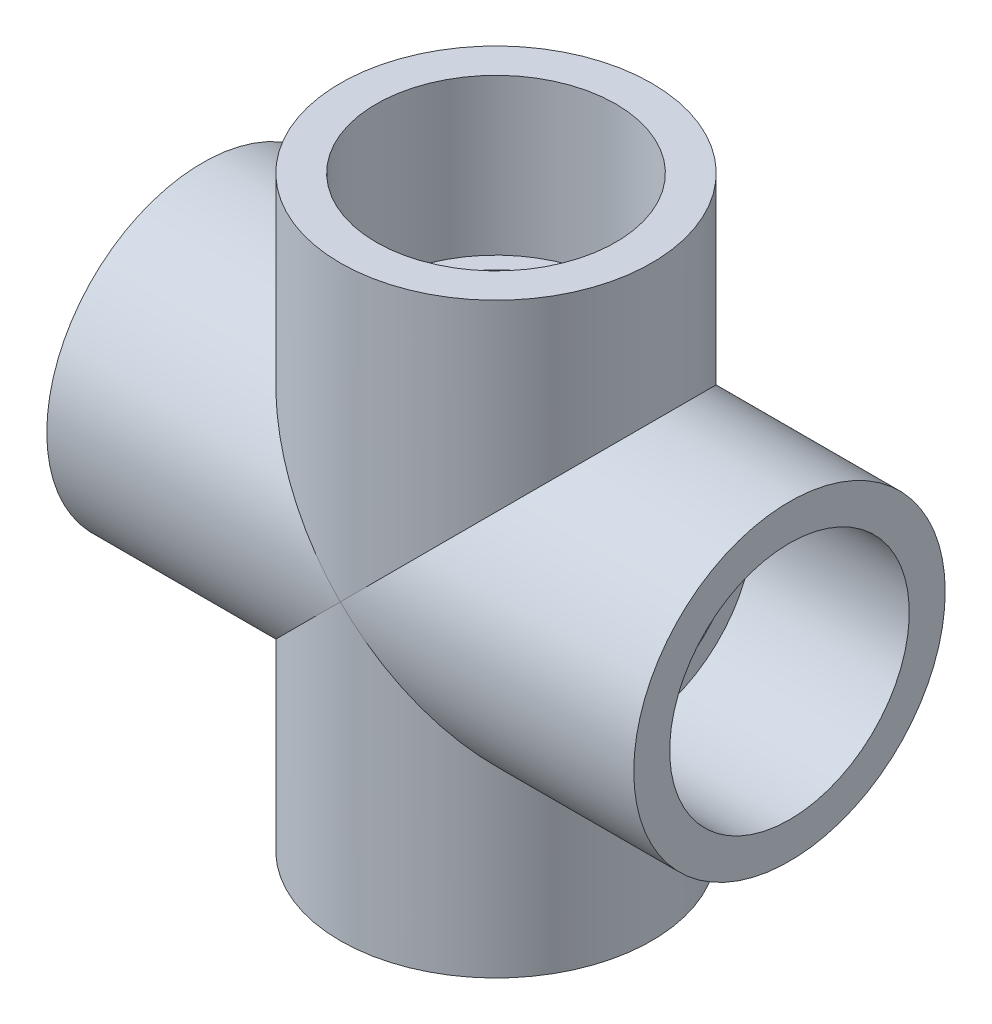
ISO-10303-21;
HEADER;
FILE_DESCRIPTION(('STEP AP214'),'2;1');
FILE_NAME('part.step','',(''),(''),'','','');
FILE_SCHEMA(('AUTOMOTIVE_DESIGN { 1 0 10303 214 1 1 1 1 }'));
ENDSEC;
DATA;
#1=APPLICATION_CONTEXT('core data for automotive mechanical design processes');
#2=APPLICATION_PROTOCOL_DEFINITION('international standard','automotive_design',2000,#1);
#3=PRODUCT_CONTEXT('',#1,'mechanical');
#4=PRODUCT('Part','Part','',(#3));
#5=PRODUCT_RELATED_PRODUCT_CATEGORY('part','',(#4));
#6=PRODUCT_DEFINITION_FORMATION('','',#4);
#7=PRODUCT_DEFINITION_CONTEXT('part definition',#1,'design');
#8=PRODUCT_DEFINITION('design','',#6,#7);
#9=PRODUCT_DEFINITION_SHAPE('','',#8);
#10=(LENGTH_UNIT() NAMED_UNIT(*) SI_UNIT(.MILLI.,.METRE.));
#11=(NAMED_UNIT(*) PLANE_ANGLE_UNIT() SI_UNIT($,.RADIAN.));
#12=(NAMED_UNIT(*) SI_UNIT($,.STERADIAN.) SOLID_ANGLE_UNIT());
#13=UNCERTAINTY_MEASURE_WITH_UNIT(LENGTH_MEASURE(1.E-05),#10,'distance_accuracy_value','');
#14=(GEOMETRIC_REPRESENTATION_CONTEXT(3) GLOBAL_UNCERTAINTY_ASSIGNED_CONTEXT((#13)) GLOBAL_UNIT_ASSIGNED_CONTEXT((#10,
#11,#12)) REPRESENTATION_CONTEXT('',''));
#15=CARTESIAN_POINT('',(0.,0.,0.));
#16=DIRECTION('',(0.,0.,1.));
#17=DIRECTION('',(1.,0.,0.));
#18=AXIS2_PLACEMENT_3D('',#15,#16,#17);
#19=CARTESIAN_POINT('',(0.000693674137099413,-2.44930632586297,0.));
#20=DIRECTION('',(0.,1.,0.));
#21=DIRECTION('',(0.,0.,1.));
#22=AXIS2_PLACEMENT_3D('',#19,#20,#21);
#23=CYLINDRICAL_SURFACE('',#22,0.85);
#24=CARTESIAN_POINT('',(0.000693674137099413,1.15069367413704,0.));
#25=DIRECTION('',(0.,1.,0.));
#26=DIRECTION('',(0.,0.,1.));
#27=AXIS2_PLACEMENT_3D('',#24,#25,#26);
#28=CIRCLE('',#27,0.85);
#29=CARTESIAN_POINT('',(0.000693674137099413,1.15069367413704,0.85));
#30=VERTEX_POINT('',#29);
#31=EDGE_CURVE('E89',#30,#30,#28,.T.);
#32=ORIENTED_EDGE('',*,*,#31,.T.);
#33=EDGE_LOOP('',(#32));
#34=FACE_BOUND('',#33,.T.);
#35=CARTESIAN_POINT('',(0.000693674137099413,0.000693674137035114,0.));
#36=DIRECTION('',(-0.707106781186546,0.707106781186549,0.));
#37=DIRECTION('',(0.707106781186549,0.707106781186546,0.));
#38=AXIS2_PLACEMENT_3D('',#35,#36,#37);
#39=ELLIPSE('',#38,1.20208152801713,0.85);
#40=CARTESIAN_POINT('',(0.000693674137099413,0.000693674137035114,-0.85));
#41=VERTEX_POINT('',#40);
#42=CARTESIAN_POINT('',(0.000693674137099413,0.000693674137035114,0.850000000000001));
#43=VERTEX_POINT('',#42);
#44=EDGE_CURVE('E52',#41,#43,#39,.F.);
#45=ORIENTED_EDGE('',*,*,#44,.T.);
#46=CARTESIAN_POINT('',(0.000693674137099413,0.000693674137035114,0.));
#47=DIRECTION('',(0.707106781186549,0.707106781186546,0.));
#48=DIRECTION('',(-0.707106781186546,0.707106781186549,0.));
#49=AXIS2_PLACEMENT_3D('',#46,#47,#48);
#50=ELLIPSE('',#49,1.20208152801713,0.85);
#51=EDGE_CURVE('E11',#43,#41,#50,.F.);
#52=ORIENTED_EDGE('',*,*,#51,.T.);
#53=EDGE_LOOP('',(#45,#52));
#54=FACE_BOUND('',#53,.T.);
#55=ADVANCED_FACE('F38',(#34,#54),#23,.F.);
#56=CARTESIAN_POINT('',(0.000693674137099413,2.45069367413704,0.));
#57=DIRECTION('',(0.,-1.,0.));
#58=DIRECTION('',(0.,0.,-1.));
#59=AXIS2_PLACEMENT_3D('',#56,#57,#58);
#60=CYLINDRICAL_SURFACE('',#59,1.3);
#61=CARTESIAN_POINT('',(0.000693674137099413,2.45069367413704,0.));
#62=DIRECTION('',(0.,1.,0.));
#63=DIRECTION('',(0.,0.,1.));
#64=AXIS2_PLACEMENT_3D('',#61,#62,#63);
#65=CIRCLE('',#64,1.3);
#66=CARTESIAN_POINT('',(0.000693674137099413,2.45069367413704,1.3));
#67=VERTEX_POINT('',#66);
#68=EDGE_CURVE('E102',#67,#67,#65,.T.);
#69=ORIENTED_EDGE('',*,*,#68,.F.);
#70=EDGE_LOOP('',(#69));
#71=FACE_BOUND('',#70,.T.);
#72=CARTESIAN_POINT('',(0.000693674137099413,0.000693674137035114,0.));
#73=DIRECTION('',(-0.707106781186549,-0.707106781186546,0.));
#74=DIRECTION('',(0.707106781186546,-0.707106781186549,0.));
#75=AXIS2_PLACEMENT_3D('',#72,#73,#74);
#76=ELLIPSE('',#75,1.83847763108503,1.3);
#77=CARTESIAN_POINT('',(0.000693674137099413,0.000693674137035114,1.3));
#78=VERTEX_POINT('',#77);
#79=CARTESIAN_POINT('',(0.000693674137099413,0.000693674137035114,-1.3));
#80=VERTEX_POINT('',#79);
#81=EDGE_CURVE('E93',#78,#80,#76,.T.);
#82=ORIENTED_EDGE('',*,*,#81,.F.);
#83=CARTESIAN_POINT('',(0.000693674137099413,0.000693674137035114,0.));
#84=DIRECTION('',(0.707106781186546,-0.707106781186549,0.));
#85=DIRECTION('',(-0.707106781186549,-0.707106781186546,0.));
#86=AXIS2_PLACEMENT_3D('',#83,#84,#85);
#87=ELLIPSE('',#86,1.83847763108502,1.3);
#88=EDGE_CURVE('E96',#80,#78,#87,.T.);
#89=ORIENTED_EDGE('',*,*,#88,.F.);
#90=EDGE_LOOP('',(#82,#89));
#91=FACE_BOUND('',#90,.T.);
#92=ADVANCED_FACE('F190',(#71,#91),#60,.T.);
#93=CARTESIAN_POINT('',(0.000693674137099413,2.45069367413704,0.));
#94=DIRECTION('',(0.,1.,0.));
#95=DIRECTION('',(0.,0.,1.));
#96=AXIS2_PLACEMENT_3D('',#93,#94,#95);
#97=PLANE('',#96);
#98=CARTESIAN_POINT('',(0.000693674137099413,2.45069367413704,0.));
#99=DIRECTION('',(0.,1.,0.));
#100=DIRECTION('',(0.,0.,1.));
#101=AXIS2_PLACEMENT_3D('',#98,#99,#100);
#102=CIRCLE('',#101,1.);
#103=CARTESIAN_POINT('',(0.000693674137099413,2.45069367413703,1.));
#104=VERTEX_POINT('',#103);
#105=EDGE_CURVE('E119',#104,#104,#102,.T.);
#106=ORIENTED_EDGE('',*,*,#105,.F.);
#107=EDGE_LOOP('',(#106));
#108=FACE_BOUND('',#107,.T.);
#109=ORIENTED_EDGE('',*,*,#68,.T.);
#110=EDGE_LOOP('',(#109));
#111=FACE_BOUND('',#110,.T.);
#112=ADVANCED_FACE('F201',(#108,#111),#97,.T.);
#113=CARTESIAN_POINT('',(-2.4493063258629,0.000693674137043668,0.));
#114=DIRECTION('',(1.,0.,0.));
#115=DIRECTION('',(0.,0.,1.));
#116=AXIS2_PLACEMENT_3D('',#113,#114,#115);
#117=PLANE('',#116);
#118=CARTESIAN_POINT('',(-2.4493063258629,0.000693674137060776,0.));
#119=DIRECTION('',(-1.,0.,0.));
#120=DIRECTION('',(0.,0.,1.));
#121=AXIS2_PLACEMENT_3D('',#118,#119,#120);
#122=CIRCLE('',#121,1.);
#123=CARTESIAN_POINT('',(-2.44930632586291,-0.999306325862939,0.));
#124=VERTEX_POINT('',#123);
#125=EDGE_CURVE('E88',#124,#124,#122,.T.);
#126=ORIENTED_EDGE('',*,*,#125,.F.);
#127=EDGE_LOOP('',(#126));
#128=FACE_BOUND('',#127,.T.);
#129=CARTESIAN_POINT('',(-2.4493063258629,0.000693674137043668,0.));
#130=DIRECTION('',(1.,0.,0.));
#131=DIRECTION('',(0.,0.,1.));
#132=AXIS2_PLACEMENT_3D('',#129,#130,#131);
#133=CIRCLE('',#132,1.3);
#134=CARTESIAN_POINT('',(-2.4493063258629,0.000693674137043668,1.3));
#135=VERTEX_POINT('',#134);
#136=EDGE_CURVE('E111',#135,#135,#133,.T.);
#137=ORIENTED_EDGE('',*,*,#136,.F.);
#138=EDGE_LOOP('',(#137));
#139=FACE_BOUND('',#138,.T.);
#140=ADVANCED_FACE('F194',(#128,#139),#117,.F.);
#141=CARTESIAN_POINT('',(2.4506936741371,0.00069367413702656,0.));
#142=DIRECTION('',(-1.,0.,0.));
#143=DIRECTION('',(0.,-1.,0.));
#144=AXIS2_PLACEMENT_3D('',#141,#142,#143);
#145=CYLINDRICAL_SURFACE('',#144,1.3);
#146=ORIENTED_EDGE('',*,*,#136,.T.);
#147=EDGE_LOOP('',(#146));
#148=FACE_BOUND('',#147,.T.);
#149=CARTESIAN_POINT('',(0.000693674137099413,0.000693674137035114,0.));
#150=DIRECTION('',(0.707106781186546,-0.707106781186549,0.));
#151=DIRECTION('',(-0.707106781186549,-0.707106781186546,0.));
#152=AXIS2_PLACEMENT_3D('',#149,#150,#151);
#153=ELLIPSE('',#152,1.83847763108502,1.3);
#154=EDGE_CURVE('E59',#80,#78,#153,.F.);
#155=ORIENTED_EDGE('',*,*,#154,.T.);
#156=ORIENTED_EDGE('',*,*,#81,.T.);
#157=EDGE_LOOP('',(#155,#156));
#158=FACE_BOUND('',#157,.T.);
#159=ADVANCED_FACE('F187',(#148,#158),#145,.T.);
#160=CARTESIAN_POINT('',(0.000693674137099413,-2.44930632586297,0.));
#161=DIRECTION('',(0.,1.,0.));
#162=DIRECTION('',(0.,0.,1.));
#163=AXIS2_PLACEMENT_3D('',#160,#161,#162);
#164=PLANE('',#163);
#165=CARTESIAN_POINT('',(0.000693674137099413,-2.44930632586297,0.));
#166=DIRECTION('',(0.,-1.,0.));
#167=DIRECTION('',(0.,0.,1.));
#168=AXIS2_PLACEMENT_3D('',#165,#166,#167);
#169=CIRCLE('',#168,1.);
#170=CARTESIAN_POINT('',(0.000693674137099413,-2.44930632586297,-1.));
#171=VERTEX_POINT('',#170);
#172=EDGE_CURVE('E135',#171,#171,#169,.T.);
#173=ORIENTED_EDGE('',*,*,#172,.F.);
#174=EDGE_LOOP('',(#173));
#175=FACE_BOUND('',#174,.T.);
#176=CARTESIAN_POINT('',(0.000693674137099413,-2.44930632586297,0.));
#177=DIRECTION('',(0.,1.,0.));
#178=DIRECTION('',(0.,0.,1.));
#179=AXIS2_PLACEMENT_3D('',#176,#177,#178);
#180=CIRCLE('',#179,1.3);
#181=CARTESIAN_POINT('',(0.000693674137099413,-2.44930632586297,1.3));
#182=VERTEX_POINT('',#181);
#183=EDGE_CURVE('E103',#182,#182,#180,.T.);
#184=ORIENTED_EDGE('',*,*,#183,.F.);
#185=EDGE_LOOP('',(#184));
#186=FACE_BOUND('',#185,.T.);
#187=ADVANCED_FACE('F193',(#175,#186),#164,.F.);
#188=ORIENTED_EDGE('',*,*,#183,.T.);
#189=EDGE_LOOP('',(#188));
#190=FACE_BOUND('',#189,.T.);
#191=CARTESIAN_POINT('',(0.000693674137099413,0.000693674137035114,0.));
#192=DIRECTION('',(-0.707106781186549,-0.707106781186546,0.));
#193=DIRECTION('',(0.707106781186546,-0.707106781186549,0.));
#194=AXIS2_PLACEMENT_3D('',#191,#192,#193);
#195=ELLIPSE('',#194,1.83847763108503,1.3);
#196=EDGE_CURVE('E78',#78,#80,#195,.F.);
#197=ORIENTED_EDGE('',*,*,#196,.F.);
#198=ORIENTED_EDGE('',*,*,#154,.F.);
#199=EDGE_LOOP('',(#197,#198));
#200=FACE_BOUND('',#199,.T.);
#201=ADVANCED_FACE('F40',(#190,#200),#60,.T.);
#202=CARTESIAN_POINT('',(2.4506936741371,0.00069367413702656,0.));
#203=DIRECTION('',(1.,0.,0.));
#204=DIRECTION('',(0.,0.,1.));
#205=AXIS2_PLACEMENT_3D('',#202,#203,#204);
#206=CIRCLE('',#205,1.3);
#207=CARTESIAN_POINT('',(2.4506936741371,0.00069367413702656,1.3));
#208=VERTEX_POINT('',#207);
#209=EDGE_CURVE('E107',#208,#208,#206,.T.);
#210=ORIENTED_EDGE('',*,*,#209,.F.);
#211=EDGE_LOOP('',(#210));
#212=FACE_BOUND('',#211,.T.);
#213=ORIENTED_EDGE('',*,*,#88,.T.);
#214=ORIENTED_EDGE('',*,*,#196,.T.);
#215=EDGE_LOOP('',(#213,#214));
#216=FACE_BOUND('',#215,.T.);
#217=ADVANCED_FACE('F180',(#212,#216),#145,.T.);
#218=CARTESIAN_POINT('',(2.4506936741371,0.00069367413702656,0.));
#219=DIRECTION('',(1.,0.,0.));
#220=DIRECTION('',(0.,0.,1.));
#221=AXIS2_PLACEMENT_3D('',#218,#219,#220);
#222=PLANE('',#221);
#223=CARTESIAN_POINT('',(2.4506936741371,0.00069367413702656,0.));
#224=DIRECTION('',(1.,0.,0.));
#225=DIRECTION('',(0.,0.,1.));
#226=AXIS2_PLACEMENT_3D('',#223,#224,#225);
#227=CIRCLE('',#226,1.);
#228=CARTESIAN_POINT('',(2.4506936741371,1.00069367413703,0.));
#229=VERTEX_POINT('',#228);
#230=EDGE_CURVE('E127',#229,#229,#227,.T.);
#231=ORIENTED_EDGE('',*,*,#230,.F.);
#232=EDGE_LOOP('',(#231));
#233=FACE_BOUND('',#232,.T.);
#234=ORIENTED_EDGE('',*,*,#209,.T.);
#235=EDGE_LOOP('',(#234));
#236=FACE_BOUND('',#235,.T.);
#237=ADVANCED_FACE('F176',(#233,#236),#222,.T.);
#238=CARTESIAN_POINT('',(0.000693674137099413,1.15069367413704,0.));
#239=DIRECTION('',(0.,1.,0.));
#240=DIRECTION('',(0.,0.,1.));
#241=AXIS2_PLACEMENT_3D('',#238,#239,#240);
#242=CYLINDRICAL_SURFACE('',#241,1.);
#243=CARTESIAN_POINT('',(0.000693674137099413,1.15069367413704,0.));
#244=DIRECTION('',(0.,1.,0.));
#245=DIRECTION('',(0.,0.,1.));
#246=AXIS2_PLACEMENT_3D('',#243,#244,#245);
#247=CIRCLE('',#246,1.);
#248=CARTESIAN_POINT('',(0.000693674137099413,1.15069367413704,1.));
#249=VERTEX_POINT('',#248);
#250=EDGE_CURVE('E115',#249,#249,#247,.T.);
#251=CARTESIAN_POINT('',(0.000693674137099413,1.15069367413704,1.));
#252=CARTESIAN_POINT('',(0.000693674137099413,1.1642353408037,1.));
#253=CARTESIAN_POINT('',(0.000693674137099413,1.17777700747037,1.));
#254=CARTESIAN_POINT('',(0.000693674137099413,1.2048603408037,1.));
#255=CARTESIAN_POINT('',(0.000693674137099413,1.21840200747037,1.));
#256=CARTESIAN_POINT('',(0.000693674137099413,1.2454853408037,1.));
#257=CARTESIAN_POINT('',(0.000693674137099413,1.25902700747037,1.));
#258=CARTESIAN_POINT('',(0.000693674137099413,1.2861103408037,1.));
#259=CARTESIAN_POINT('',(0.000693674137099413,1.29965200747037,1.));
#260=CARTESIAN_POINT('',(0.000693674137099413,1.3267353408037,1.));
#261=CARTESIAN_POINT('',(0.000693674137099413,1.34027700747037,1.));
#262=CARTESIAN_POINT('',(0.000693674137099413,1.3673603408037,1.));
#263=CARTESIAN_POINT('',(0.000693674137099413,1.38090200747037,1.));
#264=CARTESIAN_POINT('',(0.000693674137099413,1.4079853408037,1.));
#265=CARTESIAN_POINT('',(0.000693674137099413,1.42152700747037,1.));
#266=CARTESIAN_POINT('',(0.000693674137099413,1.4486103408037,1.));
#267=CARTESIAN_POINT('',(0.000693674137099413,1.46215200747037,1.));
#268=CARTESIAN_POINT('',(0.000693674137099413,1.4892353408037,1.));
#269=CARTESIAN_POINT('',(0.000693674137099413,1.50277700747037,1.));
#270=CARTESIAN_POINT('',(0.000693674137099413,1.5298603408037,1.));
#271=CARTESIAN_POINT('',(0.000693674137099413,1.54340200747037,1.));
#272=CARTESIAN_POINT('',(0.000693674137099413,1.5704853408037,1.));
#273=CARTESIAN_POINT('',(0.000693674137099413,1.58402700747037,1.));
#274=CARTESIAN_POINT('',(0.000693674137099413,1.6111103408037,1.));
#275=CARTESIAN_POINT('',(0.000693674137099413,1.62465200747037,1.));
#276=CARTESIAN_POINT('',(0.000693674137099413,1.6517353408037,1.));
#277=CARTESIAN_POINT('',(0.000693674137099413,1.66527700747037,1.));
#278=CARTESIAN_POINT('',(0.000693674137099413,1.6923603408037,1.));
#279=CARTESIAN_POINT('',(0.000693674137099413,1.70590200747037,1.));
#280=CARTESIAN_POINT('',(0.000693674137099413,1.7329853408037,1.));
#281=CARTESIAN_POINT('',(0.000693674137099413,1.74652700747037,1.));
#282=CARTESIAN_POINT('',(0.000693674137099413,1.7736103408037,1.));
#283=CARTESIAN_POINT('',(0.000693674137099413,1.78715200747037,1.));
#284=CARTESIAN_POINT('',(0.000693674137099413,1.8142353408037,1.));
#285=CARTESIAN_POINT('',(0.000693674137099413,1.82777700747037,1.));
#286=CARTESIAN_POINT('',(0.000693674137099413,1.8548603408037,1.));
#287=CARTESIAN_POINT('',(0.000693674137099413,1.86840200747037,1.));
#288=CARTESIAN_POINT('',(0.000693674137099413,1.8954853408037,1.));
#289=CARTESIAN_POINT('',(0.000693674137099413,1.90902700747037,1.));
#290=CARTESIAN_POINT('',(0.000693674137099413,1.9361103408037,1.));
#291=CARTESIAN_POINT('',(0.000693674137099413,1.94965200747037,1.));
#292=CARTESIAN_POINT('',(0.000693674137099413,1.9767353408037,1.));
#293=CARTESIAN_POINT('',(0.000693674137099413,1.99027700747037,1.));
#294=CARTESIAN_POINT('',(0.000693674137099413,2.0173603408037,1.));
#295=CARTESIAN_POINT('',(0.000693674137099413,2.03090200747037,1.));
#296=CARTESIAN_POINT('',(0.000693674137099413,2.0579853408037,1.));
#297=CARTESIAN_POINT('',(0.000693674137099413,2.07152700747037,1.));
#298=CARTESIAN_POINT('',(0.000693674137099413,2.0986103408037,1.));
#299=CARTESIAN_POINT('',(0.000693674137099413,2.11215200747037,1.));
#300=CARTESIAN_POINT('',(0.000693674137099413,2.1392353408037,1.));
#301=CARTESIAN_POINT('',(0.000693674137099413,2.15277700747037,1.));
#302=CARTESIAN_POINT('',(0.000693674137099413,2.1798603408037,1.));
#303=CARTESIAN_POINT('',(0.000693674137099413,2.19340200747037,1.));
#304=CARTESIAN_POINT('',(0.000693674137099413,2.2204853408037,1.));
#305=CARTESIAN_POINT('',(0.000693674137099413,2.23402700747037,1.));
#306=CARTESIAN_POINT('',(0.000693674137099413,2.2611103408037,1.));
#307=CARTESIAN_POINT('',(0.000693674137099413,2.27465200747037,1.));
#308=CARTESIAN_POINT('',(0.000693674137099413,2.3017353408037,1.));
#309=CARTESIAN_POINT('',(0.000693674137099413,2.31527700747037,1.));
#310=CARTESIAN_POINT('',(0.000693674137099413,2.3423603408037,1.));
#311=CARTESIAN_POINT('',(0.000693674137099413,2.35590200747037,1.));
#312=CARTESIAN_POINT('',(0.000693674137099413,2.3829853408037,1.));
#313=CARTESIAN_POINT('',(0.000693674137099413,2.39652700747037,1.));
#314=CARTESIAN_POINT('',(0.000693674137099413,2.4236103408037,1.));
#315=CARTESIAN_POINT('',(0.000693674137099413,2.43715200747037,1.));
#316=CARTESIAN_POINT('',(0.000693674137099413,2.45069367413703,1.));
#317=B_SPLINE_CURVE_WITH_KNOTS('',3,(#251,#252,#253,#254,#255,#256,#257,#258,#259,#260,#261,
#262,#263,#264,#265,#266,#267,#268,#269,#270,#271,#272,#273,#274,#275,#276,#277,#278,#279,#280,
#281,#282,#283,#284,#285,#286,#287,#288,#289,#290,#291,#292,#293,#294,#295,#296,#297,#298,#299,
#300,#301,#302,#303,#304,#305,#306,#307,#308,#309,#310,#311,#312,#313,#314,#315,#316),
.UNSPECIFIED.,.F.,.F.,(4,2,2,2,2,2,2,2,2,2,2,2,2,2,2,2,2,2,2,2,2,2,2,2,2,2,2,2,2,2,2,2,4),(0.,
0.0406249999999999,0.0812499999999999,0.121875,0.1625,0.203125,0.24375,0.284375,0.325,0.365625,
0.40625,0.446875,0.4875,0.528125,0.56875,0.609375,0.65,0.690625,0.73125,0.771875,0.8125,
0.853125,0.89375,0.934375,0.975,1.015625,1.05625,1.096875,1.1375,1.178125,1.21875,1.259375,1.3),.UNSPECIFIED.);
#318=EDGE_CURVE('BSEAM179',#249,#104,#317,.T.);
#319=ORIENTED_EDGE('',*,*,#250,.F.);
#320=ORIENTED_EDGE('',*,*,#105,.T.);
#321=ORIENTED_EDGE('',*,*,#318,.T.);
#322=ORIENTED_EDGE('',*,*,#318,.F.);
#323=EDGE_LOOP('',(#319,#321,#320,#322));
#324=FACE_BOUND('',#323,.T.);
#325=ADVANCED_FACE('F179',(#324),#242,.F.);
#326=CARTESIAN_POINT('',(0.000693674137099413,1.15069367413704,0.));
#327=DIRECTION('',(0.,1.,0.));
#328=DIRECTION('',(0.,0.,1.));
#329=AXIS2_PLACEMENT_3D('',#326,#327,#328);
#330=PLANE('',#329);
#331=ORIENTED_EDGE('',*,*,#31,.F.);
#332=EDGE_LOOP('',(#331));
#333=FACE_BOUND('',#332,.T.);
#334=ORIENTED_EDGE('',*,*,#250,.T.);
#335=EDGE_LOOP('',(#334));
#336=FACE_BOUND('',#335,.T.);
#337=ADVANCED_FACE('F172',(#333,#336),#330,.T.);
#338=CARTESIAN_POINT('',(1.1506936741371,0.000693674137031098,0.));
#339=DIRECTION('',(1.,0.,0.));
#340=DIRECTION('',(0.,1.,0.));
#341=AXIS2_PLACEMENT_3D('',#338,#339,#340);
#342=CYLINDRICAL_SURFACE('',#341,1.);
#343=CARTESIAN_POINT('',(1.1506936741371,0.000693674137031098,0.));
#344=DIRECTION('',(1.,0.,0.));
#345=DIRECTION('',(0.,0.,1.));
#346=AXIS2_PLACEMENT_3D('',#343,#344,#345);
#347=CIRCLE('',#346,1.);
#348=CARTESIAN_POINT('',(1.1506936741371,1.00069367413703,0.));
#349=VERTEX_POINT('',#348);
#350=EDGE_CURVE('E123',#349,#349,#347,.T.);
#351=CARTESIAN_POINT('',(1.1506936741371,1.00069367413703,0.));
#352=CARTESIAN_POINT('',(1.16423534080377,1.00069367413703,0.));
#353=CARTESIAN_POINT('',(1.17777700747044,1.00069367413703,0.));
#354=CARTESIAN_POINT('',(1.20486034080377,1.00069367413703,0.));
#355=CARTESIAN_POINT('',(1.21840200747044,1.00069367413703,0.));
#356=CARTESIAN_POINT('',(1.24548534080377,1.00069367413703,0.));
#357=CARTESIAN_POINT('',(1.25902700747044,1.00069367413703,0.));
#358=CARTESIAN_POINT('',(1.28611034080377,1.00069367413703,0.));
#359=CARTESIAN_POINT('',(1.29965200747044,1.00069367413703,0.));
#360=CARTESIAN_POINT('',(1.32673534080377,1.00069367413703,0.));
#361=CARTESIAN_POINT('',(1.34027700747044,1.00069367413703,0.));
#362=CARTESIAN_POINT('',(1.36736034080377,1.00069367413703,0.));
#363=CARTESIAN_POINT('',(1.38090200747044,1.00069367413703,0.));
#364=CARTESIAN_POINT('',(1.40798534080377,1.00069367413703,0.));
#365=CARTESIAN_POINT('',(1.42152700747044,1.00069367413703,0.));
#366=CARTESIAN_POINT('',(1.44861034080377,1.00069367413703,0.));
#367=CARTESIAN_POINT('',(1.46215200747044,1.00069367413703,0.));
#368=CARTESIAN_POINT('',(1.48923534080377,1.00069367413703,0.));
#369=CARTESIAN_POINT('',(1.50277700747044,1.00069367413703,0.));
#370=CARTESIAN_POINT('',(1.52986034080377,1.00069367413703,0.));
#371=CARTESIAN_POINT('',(1.54340200747044,1.00069367413703,0.));
#372=CARTESIAN_POINT('',(1.57048534080377,1.00069367413703,0.));
#373=CARTESIAN_POINT('',(1.58402700747044,1.00069367413703,0.));
#374=CARTESIAN_POINT('',(1.61111034080377,1.00069367413703,0.));
#375=CARTESIAN_POINT('',(1.62465200747044,1.00069367413703,0.));
#376=CARTESIAN_POINT('',(1.65173534080377,1.00069367413703,0.));
#377=CARTESIAN_POINT('',(1.66527700747044,1.00069367413703,0.));
#378=CARTESIAN_POINT('',(1.69236034080377,1.00069367413703,0.));
#379=CARTESIAN_POINT('',(1.70590200747044,1.00069367413703,0.));
#380=CARTESIAN_POINT('',(1.73298534080377,1.00069367413703,0.));
#381=CARTESIAN_POINT('',(1.74652700747044,1.00069367413703,0.));
#382=CARTESIAN_POINT('',(1.77361034080377,1.00069367413703,0.));
#383=CARTESIAN_POINT('',(1.78715200747044,1.00069367413703,0.));
#384=CARTESIAN_POINT('',(1.81423534080377,1.00069367413703,0.));
#385=CARTESIAN_POINT('',(1.82777700747044,1.00069367413703,0.));
#386=CARTESIAN_POINT('',(1.85486034080377,1.00069367413703,0.));
#387=CARTESIAN_POINT('',(1.86840200747044,1.00069367413703,0.));
#388=CARTESIAN_POINT('',(1.89548534080377,1.00069367413703,0.));
#389=CARTESIAN_POINT('',(1.90902700747044,1.00069367413703,0.));
#390=CARTESIAN_POINT('',(1.93611034080377,1.00069367413703,0.));
#391=CARTESIAN_POINT('',(1.94965200747044,1.00069367413703,0.));
#392=CARTESIAN_POINT('',(1.97673534080377,1.00069367413703,0.));
#393=CARTESIAN_POINT('',(1.99027700747044,1.00069367413703,0.));
#394=CARTESIAN_POINT('',(2.01736034080377,1.00069367413703,0.));
#395=CARTESIAN_POINT('',(2.03090200747044,1.00069367413703,0.));
#396=CARTESIAN_POINT('',(2.05798534080377,1.00069367413703,0.));
#397=CARTESIAN_POINT('',(2.07152700747044,1.00069367413703,0.));
#398=CARTESIAN_POINT('',(2.09861034080377,1.00069367413703,0.));
#399=CARTESIAN_POINT('',(2.11215200747044,1.00069367413703,0.));
#400=CARTESIAN_POINT('',(2.13923534080377,1.00069367413703,0.));
#401=CARTESIAN_POINT('',(2.15277700747044,1.00069367413703,0.));
#402=CARTESIAN_POINT('',(2.17986034080377,1.00069367413703,0.));
#403=CARTESIAN_POINT('',(2.19340200747044,1.00069367413703,0.));
#404=CARTESIAN_POINT('',(2.22048534080377,1.00069367413703,0.));
#405=CARTESIAN_POINT('',(2.23402700747044,1.00069367413703,0.));
#406=CARTESIAN_POINT('',(2.26111034080377,1.00069367413703,0.));
#407=CARTESIAN_POINT('',(2.27465200747044,1.00069367413703,0.));
#408=CARTESIAN_POINT('',(2.30173534080377,1.00069367413703,0.));
#409=CARTESIAN_POINT('',(2.31527700747044,1.00069367413703,0.));
#410=CARTESIAN_POINT('',(2.34236034080377,1.00069367413703,0.));
#411=CARTESIAN_POINT('',(2.35590200747044,1.00069367413703,0.));
#412=CARTESIAN_POINT('',(2.38298534080377,1.00069367413703,0.));
#413=CARTESIAN_POINT('',(2.39652700747044,1.00069367413703,0.));
#414=CARTESIAN_POINT('',(2.42361034080377,1.00069367413703,0.));
#415=CARTESIAN_POINT('',(2.43715200747044,1.00069367413703,0.));
#416=CARTESIAN_POINT('',(2.4506936741371,1.00069367413703,0.));
#417=B_SPLINE_CURVE_WITH_KNOTS('',3,(#351,#352,#353,#354,#355,#356,#357,#358,#359,#360,#361,
#362,#363,#364,#365,#366,#367,#368,#369,#370,#371,#372,#373,#374,#375,#376,#377,#378,#379,#380,
#381,#382,#383,#384,#385,#386,#387,#388,#389,#390,#391,#392,#393,#394,#395,#396,#397,#398,#399,
#400,#401,#402,#403,#404,#405,#406,#407,#408,#409,#410,#411,#412,#413,#414,#415,#416),
.UNSPECIFIED.,.F.,.F.,(4,2,2,2,2,2,2,2,2,2,2,2,2,2,2,2,2,2,2,2,2,2,2,2,2,2,2,2,2,2,2,2,4),(0.,
0.0406250000000001,0.0812500000000002,0.121875,0.1625,0.203125,0.24375,0.284375,0.325,0.365625,
0.40625,0.446875,0.4875,0.528125,0.56875,0.609375,0.65,0.690625,0.73125,0.771875,
0.812500000000001,0.853125000000001,0.893750000000001,0.934375000000001,0.975,1.015625,1.05625,
1.096875,1.1375,1.178125,1.21875,1.259375,1.3),.UNSPECIFIED.);
#418=EDGE_CURVE('BSEAM166',#349,#229,#417,.T.);
#419=ORIENTED_EDGE('',*,*,#350,.F.);
#420=ORIENTED_EDGE('',*,*,#230,.T.);
#421=ORIENTED_EDGE('',*,*,#418,.T.);
#422=ORIENTED_EDGE('',*,*,#418,.F.);
#423=EDGE_LOOP('',(#419,#421,#420,#422));
#424=FACE_BOUND('',#423,.T.);
#425=ADVANCED_FACE('F166',(#424),#342,.F.);
#426=CARTESIAN_POINT('',(1.1506936741371,0.000693674137031098,0.));
#427=DIRECTION('',(1.,0.,0.));
#428=DIRECTION('',(0.,0.,1.));
#429=AXIS2_PLACEMENT_3D('',#426,#427,#428);
#430=PLANE('',#429);
#431=CARTESIAN_POINT('',(1.1506936741371,0.000693674137031098,0.));
#432=DIRECTION('',(1.,0.,0.));
#433=DIRECTION('',(0.,0.,1.));
#434=AXIS2_PLACEMENT_3D('',#431,#432,#433);
#435=CIRCLE('',#434,0.85);
#436=CARTESIAN_POINT('',(1.1506936741371,0.000693674137031098,0.85));
#437=VERTEX_POINT('',#436);
#438=EDGE_CURVE('E156',#437,#437,#435,.T.);
#439=ORIENTED_EDGE('',*,*,#438,.F.);
#440=EDGE_LOOP('',(#439));
#441=FACE_BOUND('',#440,.T.);
#442=ORIENTED_EDGE('',*,*,#350,.T.);
#443=EDGE_LOOP('',(#442));
#444=FACE_BOUND('',#443,.T.);
#445=ADVANCED_FACE('F162',(#441,#444),#430,.T.);
#446=CARTESIAN_POINT('',(0.000693674137099413,-1.14930632586297,0.));
#447=DIRECTION('',(0.,-1.,0.));
#448=DIRECTION('',(0.,0.,-1.));
#449=AXIS2_PLACEMENT_3D('',#446,#447,#448);
#450=CYLINDRICAL_SURFACE('',#449,1.);
#451=CARTESIAN_POINT('',(0.000693674137099413,-1.14930632586297,0.));
#452=DIRECTION('',(0.,-1.,0.));
#453=DIRECTION('',(0.,0.,1.));
#454=AXIS2_PLACEMENT_3D('',#451,#452,#453);
#455=CIRCLE('',#454,1.);
#456=CARTESIAN_POINT('',(0.000693674137099413,-1.14930632586297,-1.));
#457=VERTEX_POINT('',#456);
#458=EDGE_CURVE('E131',#457,#457,#455,.T.);
#459=CARTESIAN_POINT('',(0.000693674137099413,-1.14930632586297,-1.));
#460=CARTESIAN_POINT('',(0.000693674137099413,-1.16284799252963,-1.));
#461=CARTESIAN_POINT('',(0.000693674137099413,-1.1763896591963,-1.));
#462=CARTESIAN_POINT('',(0.000693674137099413,-1.20347299252963,-1.));
#463=CARTESIAN_POINT('',(0.000693674137099413,-1.2170146591963,-1.));
#464=CARTESIAN_POINT('',(0.000693674137099413,-1.24409799252963,-1.));
#465=CARTESIAN_POINT('',(0.000693674137099413,-1.2576396591963,-1.));
#466=CARTESIAN_POINT('',(0.000693674137099413,-1.28472299252963,-1.));
#467=CARTESIAN_POINT('',(0.000693674137099413,-1.2982646591963,-1.));
#468=CARTESIAN_POINT('',(0.000693674137099413,-1.32534799252963,-1.));
#469=CARTESIAN_POINT('',(0.000693674137099413,-1.3388896591963,-1.));
#470=CARTESIAN_POINT('',(0.000693674137099413,-1.36597299252963,-1.));
#471=CARTESIAN_POINT('',(0.000693674137099413,-1.3795146591963,-1.));
#472=CARTESIAN_POINT('',(0.000693674137099413,-1.40659799252963,-1.));
#473=CARTESIAN_POINT('',(0.000693674137099413,-1.4201396591963,-1.));
#474=CARTESIAN_POINT('',(0.000693674137099413,-1.44722299252963,-1.));
#475=CARTESIAN_POINT('',(0.000693674137099413,-1.4607646591963,-1.));
#476=CARTESIAN_POINT('',(0.000693674137099413,-1.48784799252963,-1.));
#477=CARTESIAN_POINT('',(0.000693674137099413,-1.5013896591963,-1.));
#478=CARTESIAN_POINT('',(0.000693674137099413,-1.52847299252963,-1.));
#479=CARTESIAN_POINT('',(0.000693674137099413,-1.5420146591963,-1.));
#480=CARTESIAN_POINT('',(0.000693674137099413,-1.56909799252963,-1.));
#481=CARTESIAN_POINT('',(0.000693674137099413,-1.5826396591963,-1.));
#482=CARTESIAN_POINT('',(0.000693674137099413,-1.60972299252963,-1.));
#483=CARTESIAN_POINT('',(0.000693674137099413,-1.6232646591963,-1.));
#484=CARTESIAN_POINT('',(0.000693674137099413,-1.65034799252963,-1.));
#485=CARTESIAN_POINT('',(0.000693674137099413,-1.6638896591963,-1.));
#486=CARTESIAN_POINT('',(0.000693674137099413,-1.69097299252963,-1.));
#487=CARTESIAN_POINT('',(0.000693674137099413,-1.7045146591963,-1.));
#488=CARTESIAN_POINT('',(0.000693674137099413,-1.73159799252963,-1.));
#489=CARTESIAN_POINT('',(0.000693674137099413,-1.7451396591963,-1.));
#490=CARTESIAN_POINT('',(0.000693674137099413,-1.77222299252963,-1.));
#491=CARTESIAN_POINT('',(0.000693674137099413,-1.7857646591963,-1.));
#492=CARTESIAN_POINT('',(0.000693674137099413,-1.81284799252963,-1.));
#493=CARTESIAN_POINT('',(0.000693674137099413,-1.8263896591963,-1.));
#494=CARTESIAN_POINT('',(0.000693674137099413,-1.85347299252963,-1.));
#495=CARTESIAN_POINT('',(0.000693674137099413,-1.8670146591963,-1.));
#496=CARTESIAN_POINT('',(0.000693674137099413,-1.89409799252963,-1.));
#497=CARTESIAN_POINT('',(0.000693674137099413,-1.9076396591963,-1.));
#498=CARTESIAN_POINT('',(0.000693674137099413,-1.93472299252963,-1.));
#499=CARTESIAN_POINT('',(0.000693674137099413,-1.9482646591963,-1.));
#500=CARTESIAN_POINT('',(0.000693674137099413,-1.97534799252963,-1.));
#501=CARTESIAN_POINT('',(0.000693674137099413,-1.9888896591963,-1.));
#502=CARTESIAN_POINT('',(0.000693674137099413,-2.01597299252963,-1.));
#503=CARTESIAN_POINT('',(0.000693674137099413,-2.0295146591963,-1.));
#504=CARTESIAN_POINT('',(0.000693674137099413,-2.05659799252963,-1.));
#505=CARTESIAN_POINT('',(0.000693674137099413,-2.0701396591963,-1.));
#506=CARTESIAN_POINT('',(0.000693674137099413,-2.09722299252963,-1.));
#507=CARTESIAN_POINT('',(0.000693674137099413,-2.1107646591963,-1.));
#508=CARTESIAN_POINT('',(0.000693674137099413,-2.13784799252963,-1.));
#509=CARTESIAN_POINT('',(0.000693674137099413,-2.1513896591963,-1.));
#510=CARTESIAN_POINT('',(0.000693674137099413,-2.17847299252963,-1.));
#511=CARTESIAN_POINT('',(0.000693674137099413,-2.1920146591963,-1.));
#512=CARTESIAN_POINT('',(0.000693674137099413,-2.21909799252963,-1.));
#513=CARTESIAN_POINT('',(0.000693674137099413,-2.2326396591963,-1.));
#514=CARTESIAN_POINT('',(0.000693674137099413,-2.25972299252963,-1.));
#515=CARTESIAN_POINT('',(0.000693674137099413,-2.2732646591963,-1.));
#516=CARTESIAN_POINT('',(0.000693674137099413,-2.30034799252963,-1.));
#517=CARTESIAN_POINT('',(0.000693674137099413,-2.3138896591963,-1.));
#518=CARTESIAN_POINT('',(0.000693674137099413,-2.34097299252963,-1.));
#519=CARTESIAN_POINT('',(0.000693674137099413,-2.3545146591963,-1.));
#520=CARTESIAN_POINT('',(0.000693674137099413,-2.38159799252963,-1.));
#521=CARTESIAN_POINT('',(0.000693674137099413,-2.3951396591963,-1.));
#522=CARTESIAN_POINT('',(0.000693674137099413,-2.42222299252963,-1.));
#523=CARTESIAN_POINT('',(0.000693674137099413,-2.4357646591963,-1.));
#524=CARTESIAN_POINT('',(0.000693674137099413,-2.44930632586297,-1.));
#525=B_SPLINE_CURVE_WITH_KNOTS('',3,(#459,#460,#461,#462,#463,#464,#465,#466,#467,#468,#469,
#470,#471,#472,#473,#474,#475,#476,#477,#478,#479,#480,#481,#482,#483,#484,#485,#486,#487,#488,
#489,#490,#491,#492,#493,#494,#495,#496,#497,#498,#499,#500,#501,#502,#503,#504,#505,#506,#507,
#508,#509,#510,#511,#512,#513,#514,#515,#516,#517,#518,#519,#520,#521,#522,#523,#524),
.UNSPECIFIED.,.F.,.F.,(4,2,2,2,2,2,2,2,2,2,2,2,2,2,2,2,2,2,2,2,2,2,2,2,2,2,2,2,2,2,2,2,4),(0.,
0.0406249999999999,0.0812499999999999,0.121875,0.1625,0.203125,0.24375,0.284375,0.325,0.365625,
0.40625,0.446875,0.4875,0.528125,0.56875,0.609375,0.65,0.690625,0.73125,0.771875,0.8125,
0.853125,0.89375,0.934375,0.975,1.015625,1.05625,1.096875,1.1375,1.178125,1.21875,1.259375,1.3),.UNSPECIFIED.);
#526=EDGE_CURVE('BSEAM165',#457,#171,#525,.T.);
#527=ORIENTED_EDGE('',*,*,#458,.F.);
#528=ORIENTED_EDGE('',*,*,#172,.T.);
#529=ORIENTED_EDGE('',*,*,#526,.T.);
#530=ORIENTED_EDGE('',*,*,#526,.F.);
#531=EDGE_LOOP('',(#527,#529,#528,#530));
#532=FACE_BOUND('',#531,.T.);
#533=ADVANCED_FACE('F165',(#532),#450,.F.);
#534=CARTESIAN_POINT('',(0.000693674137099413,-1.14930632586297,0.));
#535=DIRECTION('',(0.,-1.,0.));
#536=DIRECTION('',(0.,0.,1.));
#537=AXIS2_PLACEMENT_3D('',#534,#535,#536);
#538=PLANE('',#537);
#539=CARTESIAN_POINT('',(0.000693674137099413,-1.14930632586297,0.));
#540=DIRECTION('',(0.,-1.,0.));
#541=DIRECTION('',(0.,0.,-1.));
#542=AXIS2_PLACEMENT_3D('',#539,#540,#541);
#543=CIRCLE('',#542,0.85);
#544=CARTESIAN_POINT('',(0.000693674137099413,-1.14930632586297,-0.85));
#545=VERTEX_POINT('',#544);
#546=EDGE_CURVE('E84',#545,#545,#543,.T.);
#547=ORIENTED_EDGE('',*,*,#546,.F.);
#548=EDGE_LOOP('',(#547));
#549=FACE_BOUND('',#548,.T.);
#550=ORIENTED_EDGE('',*,*,#458,.T.);
#551=EDGE_LOOP('',(#550));
#552=FACE_BOUND('',#551,.T.);
#553=ADVANCED_FACE('F225',(#549,#552),#538,.T.);
#554=CARTESIAN_POINT('',(-1.1493063258629,0.000693674137047159,0.));
#555=DIRECTION('',(-1.,0.,0.));
#556=DIRECTION('',(0.,-1.,0.));
#557=AXIS2_PLACEMENT_3D('',#554,#555,#556);
#558=CYLINDRICAL_SURFACE('',#557,1.);
#559=CARTESIAN_POINT('',(-1.1493063258629,0.000693674137047159,0.));
#560=DIRECTION('',(-1.,0.,0.));
#561=DIRECTION('',(0.,0.,1.));
#562=AXIS2_PLACEMENT_3D('',#559,#560,#561);
#563=CIRCLE('',#562,1.);
#564=CARTESIAN_POINT('',(-1.14930632586291,-0.999306325862953,0.));
#565=VERTEX_POINT('',#564);
#566=EDGE_CURVE('E139',#565,#565,#563,.T.);
#567=CARTESIAN_POINT('',(-1.14930632586291,-0.999306325862953,0.));
#568=CARTESIAN_POINT('',(-1.16284799252958,-0.999306325862953,0.));
#569=CARTESIAN_POINT('',(-1.17638965919624,-0.999306325862953,0.));
#570=CARTESIAN_POINT('',(-1.20347299252958,-0.999306325862952,0.));
#571=CARTESIAN_POINT('',(-1.21701465919624,-0.999306325862952,0.));
#572=CARTESIAN_POINT('',(-1.24409799252958,-0.999306325862952,0.));
#573=CARTESIAN_POINT('',(-1.25763965919624,-0.999306325862952,0.));
#574=CARTESIAN_POINT('',(-1.28472299252958,-0.999306325862951,0.));
#575=CARTESIAN_POINT('',(-1.29826465919624,-0.999306325862951,0.));
#576=CARTESIAN_POINT('',(-1.32534799252958,-0.999306325862951,0.));
#577=CARTESIAN_POINT('',(-1.33888965919624,-0.999306325862951,0.));
#578=CARTESIAN_POINT('',(-1.36597299252958,-0.999306325862951,0.));
#579=CARTESIAN_POINT('',(-1.37951465919624,-0.999306325862951,0.));
#580=CARTESIAN_POINT('',(-1.40659799252958,-0.99930632586295,0.));
#581=CARTESIAN_POINT('',(-1.42013965919624,-0.99930632586295,0.));
#582=CARTESIAN_POINT('',(-1.44722299252958,-0.99930632586295,0.));
#583=CARTESIAN_POINT('',(-1.46076465919624,-0.99930632586295,0.));
#584=CARTESIAN_POINT('',(-1.48784799252958,-0.999306325862949,0.));
#585=CARTESIAN_POINT('',(-1.50138965919624,-0.999306325862949,0.));
#586=CARTESIAN_POINT('',(-1.52847299252958,-0.999306325862949,0.));
#587=CARTESIAN_POINT('',(-1.54201465919624,-0.999306325862949,0.));
#588=CARTESIAN_POINT('',(-1.56909799252958,-0.999306325862948,0.));
#589=CARTESIAN_POINT('',(-1.58263965919625,-0.999306325862948,0.));
#590=CARTESIAN_POINT('',(-1.60972299252958,-0.999306325862948,0.));
#591=CARTESIAN_POINT('',(-1.62326465919624,-0.999306325862948,0.));
#592=CARTESIAN_POINT('',(-1.65034799252958,-0.999306325862947,0.));
#593=CARTESIAN_POINT('',(-1.66388965919624,-0.999306325862947,0.));
#594=CARTESIAN_POINT('',(-1.69097299252958,-0.999306325862947,0.));
#595=CARTESIAN_POINT('',(-1.70451465919625,-0.999306325862947,0.));
#596=CARTESIAN_POINT('',(-1.73159799252958,-0.999306325862947,0.));
#597=CARTESIAN_POINT('',(-1.74513965919624,-0.999306325862947,0.));
#598=CARTESIAN_POINT('',(-1.77222299252958,-0.999306325862946,0.));
#599=CARTESIAN_POINT('',(-1.78576465919624,-0.999306325862946,0.));
#600=CARTESIAN_POINT('',(-1.81284799252958,-0.999306325862946,0.));
#601=CARTESIAN_POINT('',(-1.82638965919624,-0.999306325862946,0.));
#602=CARTESIAN_POINT('',(-1.85347299252958,-0.999306325862946,0.));
#603=CARTESIAN_POINT('',(-1.86701465919624,-0.999306325862946,0.));
#604=CARTESIAN_POINT('',(-1.89409799252958,-0.999306325862945,0.));
#605=CARTESIAN_POINT('',(-1.90763965919625,-0.999306325862945,0.));
#606=CARTESIAN_POINT('',(-1.93472299252958,-0.999306325862945,0.));
#607=CARTESIAN_POINT('',(-1.94826465919624,-0.999306325862945,0.));
#608=CARTESIAN_POINT('',(-1.97534799252958,-0.999306325862944,0.));
#609=CARTESIAN_POINT('',(-1.98888965919625,-0.999306325862944,0.));
#610=CARTESIAN_POINT('',(-2.01597299252958,-0.999306325862944,0.));
#611=CARTESIAN_POINT('',(-2.02951465919625,-0.999306325862944,0.));
#612=CARTESIAN_POINT('',(-2.05659799252958,-0.999306325862943,0.));
#613=CARTESIAN_POINT('',(-2.07013965919625,-0.999306325862943,0.));
#614=CARTESIAN_POINT('',(-2.09722299252958,-0.999306325862943,0.));
#615=CARTESIAN_POINT('',(-2.11076465919625,-0.999306325862943,0.));
#616=CARTESIAN_POINT('',(-2.13784799252958,-0.999306325862942,0.));
#617=CARTESIAN_POINT('',(-2.15138965919625,-0.999306325862942,0.));
#618=CARTESIAN_POINT('',(-2.17847299252958,-0.999306325862942,0.));
#619=CARTESIAN_POINT('',(-2.19201465919625,-0.999306325862942,0.));
#620=CARTESIAN_POINT('',(-2.21909799252958,-0.999306325862942,0.));
#621=CARTESIAN_POINT('',(-2.23263965919624,-0.999306325862942,0.));
#622=CARTESIAN_POINT('',(-2.25972299252958,-0.999306325862941,0.));
#623=CARTESIAN_POINT('',(-2.27326465919624,-0.999306325862941,0.));
#624=CARTESIAN_POINT('',(-2.30034799252958,-0.999306325862941,0.));
#625=CARTESIAN_POINT('',(-2.31388965919625,-0.999306325862941,0.));
#626=CARTESIAN_POINT('',(-2.34097299252958,-0.99930632586294,0.));
#627=CARTESIAN_POINT('',(-2.35451465919625,-0.99930632586294,0.));
#628=CARTESIAN_POINT('',(-2.38159799252958,-0.99930632586294,0.));
#629=CARTESIAN_POINT('',(-2.39513965919625,-0.99930632586294,0.));
#630=CARTESIAN_POINT('',(-2.42222299252958,-0.999306325862939,0.));
#631=CARTESIAN_POINT('',(-2.43576465919624,-0.999306325862939,0.));
#632=CARTESIAN_POINT('',(-2.44930632586291,-0.999306325862939,0.));
#633=B_SPLINE_CURVE_WITH_KNOTS('',3,(#567,#568,#569,#570,#571,#572,#573,#574,#575,#576,#577,
#578,#579,#580,#581,#582,#583,#584,#585,#586,#587,#588,#589,#590,#591,#592,#593,#594,#595,#596,
#597,#598,#599,#600,#601,#602,#603,#604,#605,#606,#607,#608,#609,#610,#611,#612,#613,#614,#615,
#616,#617,#618,#619,#620,#621,#622,#623,#624,#625,#626,#627,#628,#629,#630,#631,#632),
.UNSPECIFIED.,.F.,.F.,(4,2,2,2,2,2,2,2,2,2,2,2,2,2,2,2,2,2,2,2,2,2,2,2,2,2,2,2,2,2,2,2,4),(0.,
0.0406250000000001,0.0812500000000002,0.121875,0.1625,0.203125,0.24375,0.284375,0.325,0.365625,
0.40625,0.446875,0.4875,0.528125,0.56875,0.609375,0.65,0.690625,0.73125,0.771875,
0.812500000000001,0.853125000000001,0.893750000000001,0.934375000000001,0.975,1.015625,1.05625,
1.096875,1.1375,1.178125,1.21875,1.259375,1.3),.UNSPECIFIED.);
#634=EDGE_CURVE('BSEAM220',#565,#124,#633,.T.);
#635=ORIENTED_EDGE('',*,*,#566,.F.);
#636=ORIENTED_EDGE('',*,*,#125,.T.);
#637=ORIENTED_EDGE('',*,*,#634,.T.);
#638=ORIENTED_EDGE('',*,*,#634,.F.);
#639=EDGE_LOOP('',(#635,#637,#636,#638));
#640=FACE_BOUND('',#639,.T.);
#641=ADVANCED_FACE('F220',(#640),#558,.F.);
#642=CARTESIAN_POINT('',(-1.1493063258629,0.000693674137047159,0.));
#643=DIRECTION('',(-1.,0.,0.));
#644=DIRECTION('',(0.,0.,1.));
#645=AXIS2_PLACEMENT_3D('',#642,#643,#644);
#646=PLANE('',#645);
#647=CARTESIAN_POINT('',(-1.1493063258629,0.000693674137039129,0.));
#648=DIRECTION('',(-1.,0.,0.));
#649=DIRECTION('',(0.,-1.,0.));
#650=AXIS2_PLACEMENT_3D('',#647,#648,#649);
#651=CIRCLE('',#650,0.85);
#652=CARTESIAN_POINT('',(-1.14930632586291,-0.849306325862961,0.));
#653=VERTEX_POINT('',#652);
#654=EDGE_CURVE('E152',#653,#653,#651,.T.);
#655=ORIENTED_EDGE('',*,*,#654,.F.);
#656=EDGE_LOOP('',(#655));
#657=FACE_BOUND('',#656,.T.);
#658=ORIENTED_EDGE('',*,*,#566,.T.);
#659=EDGE_LOOP('',(#658));
#660=FACE_BOUND('',#659,.T.);
#661=ADVANCED_FACE('F215',(#657,#660),#646,.T.);
#662=CARTESIAN_POINT('',(0.000693674137099413,0.000693674137035114,0.));
#663=DIRECTION('',(-0.707106781186546,0.707106781186549,0.));
#664=DIRECTION('',(0.707106781186549,0.707106781186546,0.));
#665=AXIS2_PLACEMENT_3D('',#662,#663,#664);
#666=ELLIPSE('',#665,1.20208152801713,0.85);
#667=EDGE_CURVE('E69',#41,#43,#666,.T.);
#668=ORIENTED_EDGE('',*,*,#667,.T.);
#669=CARTESIAN_POINT('',(0.000693674137099413,0.000693674137035114,0.));
#670=DIRECTION('',(0.707106781186549,0.707106781186546,0.));
#671=DIRECTION('',(-0.707106781186546,0.707106781186549,0.));
#672=AXIS2_PLACEMENT_3D('',#669,#670,#671);
#673=ELLIPSE('',#672,1.20208152801713,0.85);
#674=EDGE_CURVE('E47',#43,#41,#673,.T.);
#675=ORIENTED_EDGE('',*,*,#674,.T.);
#676=EDGE_LOOP('',(#668,#675));
#677=FACE_BOUND('',#676,.T.);
#678=ORIENTED_EDGE('',*,*,#546,.T.);
#679=EDGE_LOOP('',(#678));
#680=FACE_BOUND('',#679,.T.);
#681=ADVANCED_FACE('F80',(#677,#680),#23,.F.);
#682=CARTESIAN_POINT('',(-2.44930632586291,0.000693674137043668,0.));
#683=DIRECTION('',(1.,0.,0.));
#684=DIRECTION('',(0.,1.,0.));
#685=AXIS2_PLACEMENT_3D('',#682,#683,#684);
#686=CYLINDRICAL_SURFACE('',#685,0.85);
#687=ORIENTED_EDGE('',*,*,#438,.T.);
#688=EDGE_LOOP('',(#687));
#689=FACE_BOUND('',#688,.T.);
#690=ORIENTED_EDGE('',*,*,#44,.F.);
#691=ORIENTED_EDGE('',*,*,#674,.F.);
#692=EDGE_LOOP('',(#690,#691));
#693=FACE_BOUND('',#692,.T.);
#694=ADVANCED_FACE('F76',(#689,#693),#686,.F.);
#695=ORIENTED_EDGE('',*,*,#654,.T.);
#696=EDGE_LOOP('',(#695));
#697=FACE_BOUND('',#696,.T.);
#698=ORIENTED_EDGE('',*,*,#667,.F.);
#699=ORIENTED_EDGE('',*,*,#51,.F.);
#700=EDGE_LOOP('',(#698,#699));
#701=FACE_BOUND('',#700,.T.);
#702=ADVANCED_FACE('F70',(#697,#701),#686,.F.);
#703=CLOSED_SHELL('',(#55,#92,#112,#140,#159,#187,#201,#217,#237,#325,#337,#425,#445,#533,#553,
#641,#661,#681,#694,#702));
#704=MANIFOLD_SOLID_BREP('B2',#703);
#705=ADVANCED_BREP_SHAPE_REPRESENTATION('',(#18,#704),#14);
#706=SHAPE_DEFINITION_REPRESENTATION(#9,#705);
ENDSEC;
END-ISO-10303-21;
